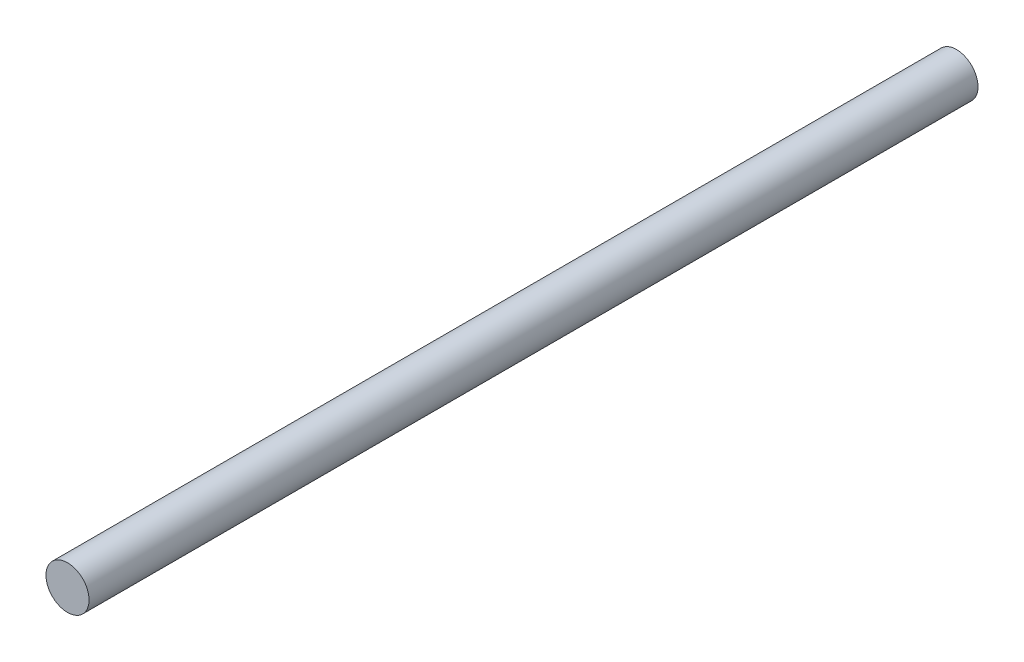
ISO-10303-21;
HEADER;
FILE_DESCRIPTION(('STEP AP214'),'2;1');
FILE_NAME('part.step','',(''),(''),'','','');
FILE_SCHEMA(('AUTOMOTIVE_DESIGN { 1 0 10303 214 1 1 1 1 }'));
ENDSEC;
DATA;
#1=APPLICATION_CONTEXT('core data for automotive mechanical design processes');
#2=APPLICATION_PROTOCOL_DEFINITION('international standard','automotive_design',2000,#1);
#3=PRODUCT_CONTEXT('',#1,'mechanical');
#4=PRODUCT('Part','Part','',(#3));
#5=PRODUCT_RELATED_PRODUCT_CATEGORY('part','',(#4));
#6=PRODUCT_DEFINITION_FORMATION('','',#4);
#7=PRODUCT_DEFINITION_CONTEXT('part definition',#1,'design');
#8=PRODUCT_DEFINITION('design','',#6,#7);
#9=PRODUCT_DEFINITION_SHAPE('','',#8);
#10=(LENGTH_UNIT() NAMED_UNIT(*) SI_UNIT(.MILLI.,.METRE.));
#11=(NAMED_UNIT(*) PLANE_ANGLE_UNIT() SI_UNIT($,.RADIAN.));
#12=(NAMED_UNIT(*) SI_UNIT($,.STERADIAN.) SOLID_ANGLE_UNIT());
#13=UNCERTAINTY_MEASURE_WITH_UNIT(LENGTH_MEASURE(1.E-05),#10,'distance_accuracy_value','');
#14=(GEOMETRIC_REPRESENTATION_CONTEXT(3) GLOBAL_UNCERTAINTY_ASSIGNED_CONTEXT((#13)) GLOBAL_UNIT_ASSIGNED_CONTEXT((#10,
#11,#12)) REPRESENTATION_CONTEXT('',''));
#15=CARTESIAN_POINT('',(0.,0.,0.));
#16=DIRECTION('',(0.,0.,1.));
#17=DIRECTION('',(1.,0.,0.));
#18=AXIS2_PLACEMENT_3D('',#15,#16,#17);
#19=CARTESIAN_POINT('',(0.,0.,165.));
#20=DIRECTION('',(0.,0.,-1.));
#21=DIRECTION('',(-1.,0.,0.));
#22=AXIS2_PLACEMENT_3D('',#19,#20,#21);
#23=CYLINDRICAL_SURFACE('',#22,4.);
#24=CARTESIAN_POINT('',(0.,0.,165.));
#25=DIRECTION('',(0.,0.,1.));
#26=DIRECTION('',(1.,0.,0.));
#27=AXIS2_PLACEMENT_3D('',#24,#25,#26);
#28=CIRCLE('',#27,4.);
#29=CARTESIAN_POINT('',(4.,0.,165.));
#30=VERTEX_POINT('',#29);
#31=EDGE_CURVE('E10',#30,#30,#28,.T.);
#32=ORIENTED_EDGE('',*,*,#31,.F.);
#33=EDGE_LOOP('',(#32));
#34=FACE_BOUND('',#33,.T.);
#35=CARTESIAN_POINT('',(0.,0.,0.));
#36=DIRECTION('',(0.,0.,1.));
#37=DIRECTION('',(1.,0.,0.));
#38=AXIS2_PLACEMENT_3D('',#35,#36,#37);
#39=CIRCLE('',#38,4.);
#40=CARTESIAN_POINT('',(4.,0.,0.));
#41=VERTEX_POINT('',#40);
#42=EDGE_CURVE('E31',#41,#41,#39,.T.);
#43=ORIENTED_EDGE('',*,*,#42,.T.);
#44=EDGE_LOOP('',(#43));
#45=FACE_BOUND('',#44,.T.);
#46=ADVANCED_FACE('F28',(#34,#45),#23,.T.);
#47=CARTESIAN_POINT('',(0.,0.,165.));
#48=DIRECTION('',(0.,0.,1.));
#49=DIRECTION('',(1.,0.,0.));
#50=AXIS2_PLACEMENT_3D('',#47,#48,#49);
#51=PLANE('',#50);
#52=ORIENTED_EDGE('',*,*,#31,.T.);
#53=EDGE_LOOP('',(#52));
#54=FACE_BOUND('',#53,.T.);
#55=ADVANCED_FACE('F43',(#54),#51,.T.);
#56=CARTESIAN_POINT('',(0.,0.,0.));
#57=DIRECTION('',(0.,0.,1.));
#58=DIRECTION('',(1.,0.,0.));
#59=AXIS2_PLACEMENT_3D('',#56,#57,#58);
#60=PLANE('',#59);
#61=ORIENTED_EDGE('',*,*,#42,.F.);
#62=EDGE_LOOP('',(#61));
#63=FACE_BOUND('',#62,.T.);
#64=ADVANCED_FACE('F41',(#63),#60,.F.);
#65=CLOSED_SHELL('',(#46,#55,#64));
#66=MANIFOLD_SOLID_BREP('B2',#65);
#67=ADVANCED_BREP_SHAPE_REPRESENTATION('',(#18,#66),#14);
#68=SHAPE_DEFINITION_REPRESENTATION(#9,#67);
ENDSEC;
END-ISO-10303-21;
